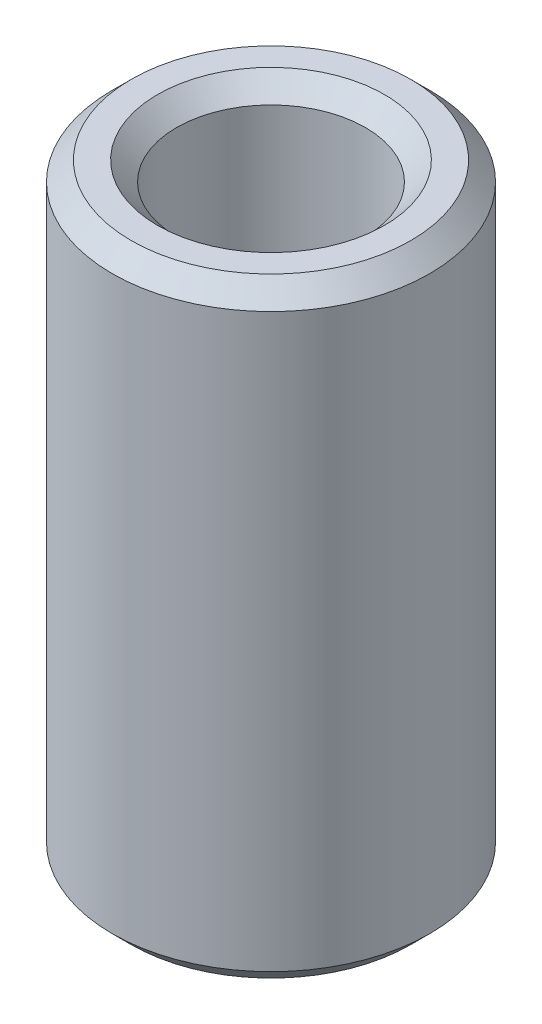
ISO-10303-21;
HEADER;
FILE_DESCRIPTION(('STEP AP214'),'2;1');
FILE_NAME('part.step','',(''),(''),'','','');
FILE_SCHEMA(('AUTOMOTIVE_DESIGN { 1 0 10303 214 1 1 1 1 }'));
ENDSEC;
DATA;
#1=APPLICATION_CONTEXT('core data for automotive mechanical design processes');
#2=APPLICATION_PROTOCOL_DEFINITION('international standard','automotive_design',2000,#1);
#3=PRODUCT_CONTEXT('',#1,'mechanical');
#4=PRODUCT('Part','Part','',(#3));
#5=PRODUCT_RELATED_PRODUCT_CATEGORY('part','',(#4));
#6=PRODUCT_DEFINITION_FORMATION('','',#4);
#7=PRODUCT_DEFINITION_CONTEXT('part definition',#1,'design');
#8=PRODUCT_DEFINITION('design','',#6,#7);
#9=PRODUCT_DEFINITION_SHAPE('','',#8);
#10=(LENGTH_UNIT() NAMED_UNIT(*) SI_UNIT(.MILLI.,.METRE.));
#11=(NAMED_UNIT(*) PLANE_ANGLE_UNIT() SI_UNIT($,.RADIAN.));
#12=(NAMED_UNIT(*) SI_UNIT($,.STERADIAN.) SOLID_ANGLE_UNIT());
#13=UNCERTAINTY_MEASURE_WITH_UNIT(LENGTH_MEASURE(1.E-05),#10,'distance_accuracy_value','');
#14=(GEOMETRIC_REPRESENTATION_CONTEXT(3) GLOBAL_UNCERTAINTY_ASSIGNED_CONTEXT((#13)) GLOBAL_UNIT_ASSIGNED_CONTEXT((#10,
#11,#12)) REPRESENTATION_CONTEXT('',''));
#15=CARTESIAN_POINT('',(0.,0.,0.));
#16=DIRECTION('',(0.,0.,1.));
#17=DIRECTION('',(1.,0.,0.));
#18=AXIS2_PLACEMENT_3D('',#15,#16,#17);
#19=CARTESIAN_POINT('',(0.,12.,0.));
#20=DIRECTION('',(0.,1.,0.));
#21=DIRECTION('',(0.,0.,1.));
#22=AXIS2_PLACEMENT_3D('',#19,#20,#21);
#23=PLANE('',#22);
#24=CARTESIAN_POINT('',(0.,12.,0.));
#25=DIRECTION('',(0.,1.,0.));
#26=DIRECTION('',(0.,0.,1.));
#27=AXIS2_PLACEMENT_3D('',#24,#25,#26);
#28=CIRCLE('',#27,4.465);
#29=CARTESIAN_POINT('',(0.,12.,4.465));
#30=VERTEX_POINT('',#29);
#31=EDGE_CURVE('E58',#30,#30,#28,.F.);
#32=ORIENTED_EDGE('',*,*,#31,.T.);
#33=EDGE_LOOP('',(#32));
#34=FACE_BOUND('',#33,.T.);
#35=CARTESIAN_POINT('',(0.,12.,0.));
#36=DIRECTION('',(0.,1.,0.));
#37=DIRECTION('',(0.,0.,1.));
#38=AXIS2_PLACEMENT_3D('',#35,#36,#37);
#39=CIRCLE('',#38,5.50000000000001);
#40=CARTESIAN_POINT('',(0.,12.,5.50000000000001));
#41=VERTEX_POINT('',#40);
#42=EDGE_CURVE('E61',#41,#41,#39,.T.);
#43=ORIENTED_EDGE('',*,*,#42,.T.);
#44=EDGE_LOOP('',(#43));
#45=FACE_BOUND('',#44,.T.);
#46=ADVANCED_FACE('F37',(#34,#45),#23,.T.);
#47=CARTESIAN_POINT('',(0.,-12.,0.));
#48=DIRECTION('',(0.,1.,0.));
#49=DIRECTION('',(0.,0.,1.));
#50=AXIS2_PLACEMENT_3D('',#47,#48,#49);
#51=PLANE('',#50);
#52=CARTESIAN_POINT('',(0.,-12.,0.));
#53=DIRECTION('',(0.,1.,0.));
#54=DIRECTION('',(0.,0.,1.));
#55=AXIS2_PLACEMENT_3D('',#52,#53,#54);
#56=CIRCLE('',#55,4.465);
#57=CARTESIAN_POINT('',(0.,-12.,4.465));
#58=VERTEX_POINT('',#57);
#59=EDGE_CURVE('E49',#58,#58,#56,.T.);
#60=ORIENTED_EDGE('',*,*,#59,.T.);
#61=EDGE_LOOP('',(#60));
#62=FACE_BOUND('',#61,.T.);
#63=CARTESIAN_POINT('',(0.,-12.,0.));
#64=DIRECTION('',(0.,1.,0.));
#65=DIRECTION('',(0.,0.,1.));
#66=AXIS2_PLACEMENT_3D('',#63,#64,#65);
#67=CIRCLE('',#66,5.5);
#68=CARTESIAN_POINT('',(0.,-12.,5.5));
#69=VERTEX_POINT('',#68);
#70=EDGE_CURVE('E53',#69,#69,#67,.F.);
#71=ORIENTED_EDGE('',*,*,#70,.T.);
#72=EDGE_LOOP('',(#71));
#73=FACE_BOUND('',#72,.T.);
#74=ADVANCED_FACE('F81',(#62,#73),#51,.F.);
#75=CARTESIAN_POINT('',(0.,12.,0.));
#76=DIRECTION('',(0.,-1.,0.));
#77=DIRECTION('',(0.,0.,-1.));
#78=AXIS2_PLACEMENT_3D('',#75,#76,#77);
#79=CYLINDRICAL_SURFACE('',#78,6.25);
#80=CARTESIAN_POINT('',(0.,-11.25,0.));
#81=DIRECTION('',(0.,1.,0.));
#82=DIRECTION('',(0.,0.,1.));
#83=AXIS2_PLACEMENT_3D('',#80,#81,#82);
#84=CIRCLE('',#83,6.25);
#85=CARTESIAN_POINT('',(0.,-11.25,6.25));
#86=VERTEX_POINT('',#85);
#87=EDGE_CURVE('E10',#86,#86,#84,.T.);
#88=ORIENTED_EDGE('',*,*,#87,.T.);
#89=EDGE_LOOP('',(#88));
#90=FACE_BOUND('',#89,.T.);
#91=CARTESIAN_POINT('',(0.,11.25,0.));
#92=DIRECTION('',(0.,1.,0.));
#93=DIRECTION('',(0.,0.,1.));
#94=AXIS2_PLACEMENT_3D('',#91,#92,#93);
#95=CIRCLE('',#94,6.25);
#96=CARTESIAN_POINT('',(0.,11.25,6.25));
#97=VERTEX_POINT('',#96);
#98=EDGE_CURVE('E45',#97,#97,#95,.F.);
#99=ORIENTED_EDGE('',*,*,#98,.T.);
#100=EDGE_LOOP('',(#99));
#101=FACE_BOUND('',#100,.T.);
#102=ADVANCED_FACE('F84',(#90,#101),#79,.T.);
#103=CARTESIAN_POINT('',(0.,12.,0.));
#104=DIRECTION('',(0.,-1.,0.));
#105=DIRECTION('',(0.,0.,-1.));
#106=AXIS2_PLACEMENT_3D('',#103,#104,#105);
#107=CYLINDRICAL_SURFACE('',#106,3.715);
#108=CARTESIAN_POINT('',(0.,11.25,0.));
#109=DIRECTION('',(0.,1.,0.));
#110=DIRECTION('',(0.,0.,1.));
#111=AXIS2_PLACEMENT_3D('',#108,#109,#110);
#112=CIRCLE('',#111,3.715);
#113=CARTESIAN_POINT('',(0.,11.25,3.715));
#114=VERTEX_POINT('',#113);
#115=EDGE_CURVE('E64',#114,#114,#112,.T.);
#116=ORIENTED_EDGE('',*,*,#115,.T.);
#117=EDGE_LOOP('',(#116));
#118=FACE_BOUND('',#117,.T.);
#119=CARTESIAN_POINT('',(0.,-11.25,0.));
#120=DIRECTION('',(0.,1.,0.));
#121=DIRECTION('',(0.,0.,1.));
#122=AXIS2_PLACEMENT_3D('',#119,#120,#121);
#123=CIRCLE('',#122,3.715);
#124=CARTESIAN_POINT('',(0.,-11.25,3.715));
#125=VERTEX_POINT('',#124);
#126=EDGE_CURVE('E67',#125,#125,#123,.F.);
#127=ORIENTED_EDGE('',*,*,#126,.T.);
#128=EDGE_LOOP('',(#127));
#129=FACE_BOUND('',#128,.T.);
#130=ADVANCED_FACE('F71',(#118,#129),#107,.F.);
#131=CARTESIAN_POINT('',(0.,11.25,0.));
#132=DIRECTION('',(0.,1.,0.));
#133=DIRECTION('',(0.,0.,1.));
#134=AXIS2_PLACEMENT_3D('',#131,#132,#133);
#135=CONICAL_SURFACE('',#134,3.715,0.785398163397453);
#136=ORIENTED_EDGE('',*,*,#31,.F.);
#137=EDGE_LOOP('',(#136));
#138=FACE_BOUND('',#137,.T.);
#139=ORIENTED_EDGE('',*,*,#115,.F.);
#140=EDGE_LOOP('',(#139));
#141=FACE_BOUND('',#140,.T.);
#142=ADVANCED_FACE('F77',(#138,#141),#135,.F.);
#143=CARTESIAN_POINT('',(0.,-12.,0.));
#144=DIRECTION('',(0.,-1.,0.));
#145=DIRECTION('',(0.,0.,-1.));
#146=AXIS2_PLACEMENT_3D('',#143,#144,#145);
#147=CONICAL_SURFACE('',#146,4.465,0.785398163397446);
#148=ORIENTED_EDGE('',*,*,#126,.F.);
#149=EDGE_LOOP('',(#148));
#150=FACE_BOUND('',#149,.T.);
#151=ORIENTED_EDGE('',*,*,#59,.F.);
#152=EDGE_LOOP('',(#151));
#153=FACE_BOUND('',#152,.T.);
#154=ADVANCED_FACE('F73',(#150,#153),#147,.F.);
#155=CARTESIAN_POINT('',(0.,-11.25,0.));
#156=DIRECTION('',(0.,1.,0.));
#157=DIRECTION('',(0.,0.,1.));
#158=AXIS2_PLACEMENT_3D('',#155,#156,#157);
#159=CONICAL_SURFACE('',#158,6.25,0.78539816339745);
#160=ORIENTED_EDGE('',*,*,#70,.F.);
#161=EDGE_LOOP('',(#160));
#162=FACE_BOUND('',#161,.T.);
#163=ORIENTED_EDGE('',*,*,#87,.F.);
#164=EDGE_LOOP('',(#163));
#165=FACE_BOUND('',#164,.T.);
#166=ADVANCED_FACE('F76',(#162,#165),#159,.T.);
#167=CARTESIAN_POINT('',(0.,12.,0.));
#168=DIRECTION('',(0.,-1.,0.));
#169=DIRECTION('',(0.,0.,-1.));
#170=AXIS2_PLACEMENT_3D('',#167,#168,#169);
#171=CONICAL_SURFACE('',#170,5.50000000000001,0.785398163397445);
#172=ORIENTED_EDGE('',*,*,#98,.F.);
#173=EDGE_LOOP('',(#172));
#174=FACE_BOUND('',#173,.T.);
#175=ORIENTED_EDGE('',*,*,#42,.F.);
#176=EDGE_LOOP('',(#175));
#177=FACE_BOUND('',#176,.T.);
#178=ADVANCED_FACE('F40',(#174,#177),#171,.T.);
#179=CLOSED_SHELL('',(#46,#74,#102,#130,#142,#154,#166,#178));
#180=MANIFOLD_SOLID_BREP('B2',#179);
#181=ADVANCED_BREP_SHAPE_REPRESENTATION('',(#18,#180),#14);
#182=SHAPE_DEFINITION_REPRESENTATION(#9,#181);
ENDSEC;
END-ISO-10303-21;
